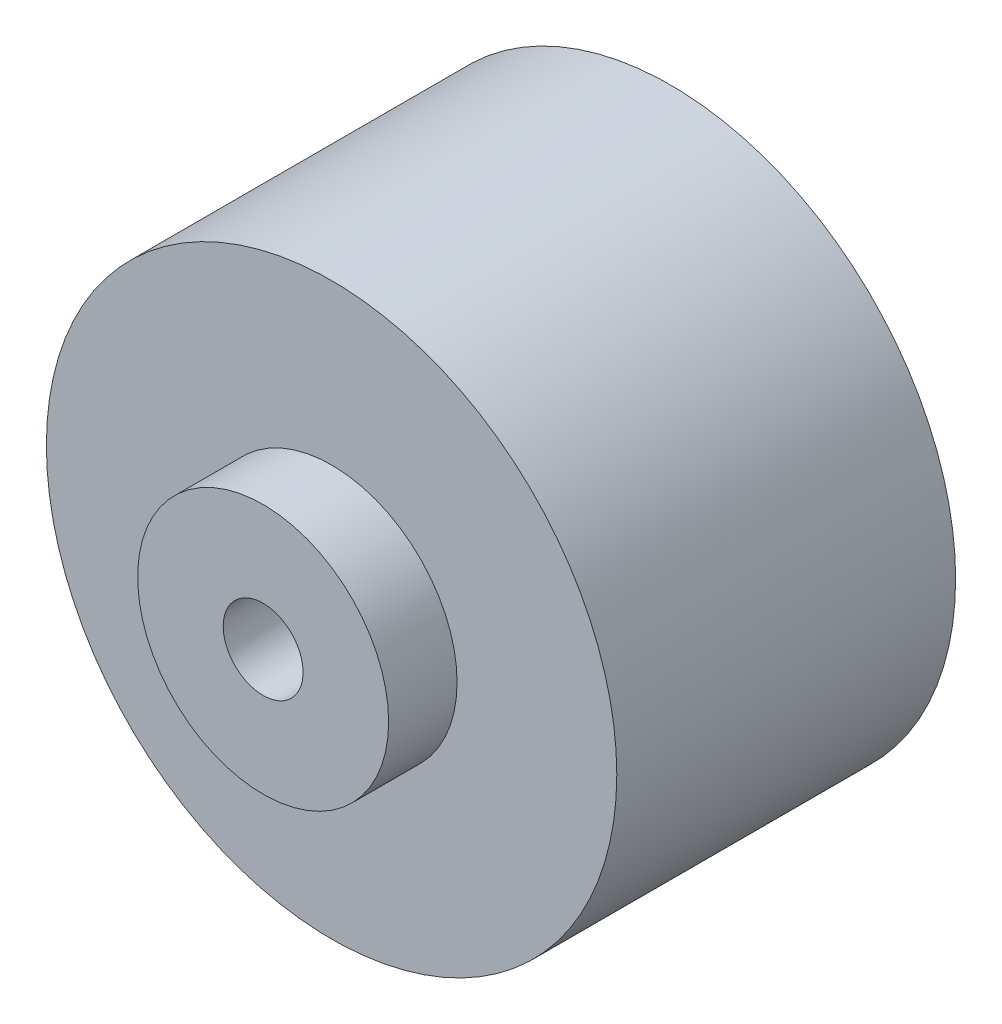
ISO-10303-21;
HEADER;
FILE_DESCRIPTION(('STEP AP214'),'2;1');
FILE_NAME('part.step','',(''),(''),'','','');
FILE_SCHEMA(('AUTOMOTIVE_DESIGN { 1 0 10303 214 1 1 1 1 }'));
ENDSEC;
DATA;
#1=APPLICATION_CONTEXT('core data for automotive mechanical design processes');
#2=APPLICATION_PROTOCOL_DEFINITION('international standard','automotive_design',2000,#1);
#3=PRODUCT_CONTEXT('',#1,'mechanical');
#4=PRODUCT('Part','Part','',(#3));
#5=PRODUCT_RELATED_PRODUCT_CATEGORY('part','',(#4));
#6=PRODUCT_DEFINITION_FORMATION('','',#4);
#7=PRODUCT_DEFINITION_CONTEXT('part definition',#1,'design');
#8=PRODUCT_DEFINITION('design','',#6,#7);
#9=PRODUCT_DEFINITION_SHAPE('','',#8);
#10=(LENGTH_UNIT() NAMED_UNIT(*) SI_UNIT(.MILLI.,.METRE.));
#11=(NAMED_UNIT(*) PLANE_ANGLE_UNIT() SI_UNIT($,.RADIAN.));
#12=(NAMED_UNIT(*) SI_UNIT($,.STERADIAN.) SOLID_ANGLE_UNIT());
#13=UNCERTAINTY_MEASURE_WITH_UNIT(LENGTH_MEASURE(1.E-05),#10,'distance_accuracy_value','');
#14=(GEOMETRIC_REPRESENTATION_CONTEXT(3) GLOBAL_UNCERTAINTY_ASSIGNED_CONTEXT((#13)) GLOBAL_UNIT_ASSIGNED_CONTEXT((#10,
#11,#12)) REPRESENTATION_CONTEXT('',''));
#15=CARTESIAN_POINT('',(0.,0.,0.));
#16=DIRECTION('',(0.,0.,1.));
#17=DIRECTION('',(1.,0.,0.));
#18=AXIS2_PLACEMENT_3D('',#15,#16,#17);
#19=CARTESIAN_POINT('',(0.,0.,29.7));
#20=DIRECTION('',(0.,0.,-1.));
#21=DIRECTION('',(-1.,0.,0.));
#22=AXIS2_PLACEMENT_3D('',#19,#20,#21);
#23=CYLINDRICAL_SURFACE('',#22,25.);
#24=CARTESIAN_POINT('',(0.,0.,29.7));
#25=DIRECTION('',(0.,0.,1.));
#26=DIRECTION('',(1.,0.,0.));
#27=AXIS2_PLACEMENT_3D('',#24,#25,#26);
#28=CIRCLE('',#27,25.);
#29=CARTESIAN_POINT('',(25.,0.,29.7));
#30=VERTEX_POINT('',#29);
#31=EDGE_CURVE('E50',#30,#30,#28,.T.);
#32=ORIENTED_EDGE('',*,*,#31,.F.);
#33=EDGE_LOOP('',(#32));
#34=FACE_BOUND('',#33,.T.);
#35=CARTESIAN_POINT('',(0.,0.,0.));
#36=DIRECTION('',(0.,0.,1.));
#37=DIRECTION('',(1.,0.,0.));
#38=AXIS2_PLACEMENT_3D('',#35,#36,#37);
#39=CIRCLE('',#38,25.);
#40=CARTESIAN_POINT('',(25.,0.,0.));
#41=VERTEX_POINT('',#40);
#42=EDGE_CURVE('E41',#41,#41,#39,.T.);
#43=ORIENTED_EDGE('',*,*,#42,.T.);
#44=EDGE_LOOP('',(#43));
#45=FACE_BOUND('',#44,.T.);
#46=ADVANCED_FACE('F38',(#34,#45),#23,.T.);
#47=CARTESIAN_POINT('',(0.,0.,29.7));
#48=DIRECTION('',(0.,0.,1.));
#49=DIRECTION('',(1.,0.,0.));
#50=AXIS2_PLACEMENT_3D('',#47,#48,#49);
#51=PLANE('',#50);
#52=CARTESIAN_POINT('',(0.,0.,29.7));
#53=DIRECTION('',(0.,0.,1.));
#54=DIRECTION('',(1.,0.,0.));
#55=AXIS2_PLACEMENT_3D('',#52,#53,#54);
#56=CIRCLE('',#55,11.);
#57=CARTESIAN_POINT('',(11.,0.,29.7));
#58=VERTEX_POINT('',#57);
#59=EDGE_CURVE('E45',#58,#58,#56,.T.);
#60=ORIENTED_EDGE('',*,*,#59,.F.);
#61=EDGE_LOOP('',(#60));
#62=FACE_BOUND('',#61,.T.);
#63=ORIENTED_EDGE('',*,*,#31,.T.);
#64=EDGE_LOOP('',(#63));
#65=FACE_BOUND('',#64,.T.);
#66=ADVANCED_FACE('F68',(#62,#65),#51,.T.);
#67=CARTESIAN_POINT('',(0.,0.,0.));
#68=DIRECTION('',(0.,0.,1.));
#69=DIRECTION('',(1.,0.,0.));
#70=AXIS2_PLACEMENT_3D('',#67,#68,#69);
#71=PLANE('',#70);
#72=CARTESIAN_POINT('',(0.,0.,0.));
#73=DIRECTION('',(0.,0.,-1.));
#74=DIRECTION('',(-1.,0.,0.));
#75=AXIS2_PLACEMENT_3D('',#72,#73,#74);
#76=CIRCLE('',#75,12.25);
#77=CARTESIAN_POINT('',(-12.25,0.,0.));
#78=VERTEX_POINT('',#77);
#79=EDGE_CURVE('E10',#78,#78,#76,.T.);
#80=ORIENTED_EDGE('',*,*,#79,.F.);
#81=EDGE_LOOP('',(#80));
#82=FACE_BOUND('',#81,.T.);
#83=ORIENTED_EDGE('',*,*,#42,.F.);
#84=EDGE_LOOP('',(#83));
#85=FACE_BOUND('',#84,.T.);
#86=ADVANCED_FACE('F65',(#82,#85),#71,.F.);
#87=CARTESIAN_POINT('',(0.,0.,35.7));
#88=DIRECTION('',(0.,0.,-1.));
#89=DIRECTION('',(-1.,0.,0.));
#90=AXIS2_PLACEMENT_3D('',#87,#88,#89);
#91=CYLINDRICAL_SURFACE('',#90,11.);
#92=CARTESIAN_POINT('',(0.,0.,35.7));
#93=DIRECTION('',(0.,0.,1.));
#94=DIRECTION('',(1.,0.,0.));
#95=AXIS2_PLACEMENT_3D('',#92,#93,#94);
#96=CIRCLE('',#95,11.);
#97=CARTESIAN_POINT('',(11.,0.,35.7));
#98=VERTEX_POINT('',#97);
#99=EDGE_CURVE('E56',#98,#98,#96,.T.);
#100=ORIENTED_EDGE('',*,*,#99,.F.);
#101=EDGE_LOOP('',(#100));
#102=FACE_BOUND('',#101,.T.);
#103=ORIENTED_EDGE('',*,*,#59,.T.);
#104=EDGE_LOOP('',(#103));
#105=FACE_BOUND('',#104,.T.);
#106=ADVANCED_FACE('F67',(#102,#105),#91,.T.);
#107=CARTESIAN_POINT('',(0.,0.,35.7));
#108=DIRECTION('',(0.,0.,1.));
#109=DIRECTION('',(1.,0.,0.));
#110=AXIS2_PLACEMENT_3D('',#107,#108,#109);
#111=PLANE('',#110);
#112=CARTESIAN_POINT('',(0.,0.,35.7));
#113=DIRECTION('',(0.,0.,-1.));
#114=DIRECTION('',(-1.,0.,0.));
#115=AXIS2_PLACEMENT_3D('',#112,#113,#114);
#116=CIRCLE('',#115,3.5);
#117=CARTESIAN_POINT('',(-3.5,0.,35.7));
#118=VERTEX_POINT('',#117);
#119=EDGE_CURVE('E143',#118,#118,#116,.T.);
#120=ORIENTED_EDGE('',*,*,#119,.T.);
#121=EDGE_LOOP('',(#120));
#122=FACE_BOUND('',#121,.T.);
#123=ORIENTED_EDGE('',*,*,#99,.T.);
#124=EDGE_LOOP('',(#123));
#125=FACE_BOUND('',#124,.T.);
#126=ADVANCED_FACE('F74',(#122,#125),#111,.T.);
#127=CARTESIAN_POINT('',(0.,0.,-9.));
#128=DIRECTION('',(0.,0.,1.));
#129=DIRECTION('',(1.,0.,0.));
#130=AXIS2_PLACEMENT_3D('',#127,#128,#129);
#131=CYLINDRICAL_SURFACE('',#130,12.25);
#132=CARTESIAN_POINT('',(0.,0.,-9.));
#133=DIRECTION('',(0.,0.,-1.));
#134=DIRECTION('',(-1.,0.,0.));
#135=AXIS2_PLACEMENT_3D('',#132,#133,#134);
#136=CIRCLE('',#135,12.25);
#137=CARTESIAN_POINT('',(-12.25,0.,-9.));
#138=VERTEX_POINT('',#137);
#139=EDGE_CURVE('E54',#138,#138,#136,.T.);
#140=ORIENTED_EDGE('',*,*,#139,.F.);
#141=EDGE_LOOP('',(#140));
#142=FACE_BOUND('',#141,.T.);
#143=ORIENTED_EDGE('',*,*,#79,.T.);
#144=EDGE_LOOP('',(#143));
#145=FACE_BOUND('',#144,.T.);
#146=ADVANCED_FACE('F104',(#142,#145),#131,.T.);
#147=CARTESIAN_POINT('',(0.,0.,-9.));
#148=DIRECTION('',(0.,0.,-1.));
#149=DIRECTION('',(-1.,0.,0.));
#150=AXIS2_PLACEMENT_3D('',#147,#148,#149);
#151=PLANE('',#150);
#152=CARTESIAN_POINT('',(0.,0.,-9.));
#153=DIRECTION('',(0.,0.,-1.));
#154=DIRECTION('',(-1.,0.,0.));
#155=AXIS2_PLACEMENT_3D('',#152,#153,#154);
#156=CIRCLE('',#155,3.5);
#157=CARTESIAN_POINT('',(-3.5,0.,-8.99999999999999));
#158=VERTEX_POINT('',#157);
#159=EDGE_CURVE('E146',#158,#158,#156,.T.);
#160=ORIENTED_EDGE('',*,*,#159,.F.);
#161=EDGE_LOOP('',(#160));
#162=FACE_BOUND('',#161,.T.);
#163=ORIENTED_EDGE('',*,*,#139,.T.);
#164=EDGE_LOOP('',(#163));
#165=FACE_BOUND('',#164,.T.);
#166=ADVANCED_FACE('F109',(#162,#165),#151,.T.);
#167=CARTESIAN_POINT('',(0.,0.,35.7));
#168=DIRECTION('',(0.,0.,-1.));
#169=DIRECTION('',(-1.,0.,0.));
#170=AXIS2_PLACEMENT_3D('',#167,#168,#169);
#171=CYLINDRICAL_SURFACE('',#170,3.5);
#172=CARTESIAN_POINT('',(-3.5,0.,35.7));
#173=CARTESIAN_POINT('',(-3.5,0.,35.234375));
#174=CARTESIAN_POINT('',(-3.5,0.,34.76875));
#175=CARTESIAN_POINT('',(-3.5,0.,33.8375));
#176=CARTESIAN_POINT('',(-3.5,0.,33.371875));
#177=CARTESIAN_POINT('',(-3.5,0.,32.440625));
#178=CARTESIAN_POINT('',(-3.5,0.,31.975));
#179=CARTESIAN_POINT('',(-3.5,0.,31.04375));
#180=CARTESIAN_POINT('',(-3.5,0.,30.578125));
#181=CARTESIAN_POINT('',(-3.5,0.,29.646875));
#182=CARTESIAN_POINT('',(-3.5,0.,29.18125));
#183=CARTESIAN_POINT('',(-3.5,0.,28.25));
#184=CARTESIAN_POINT('',(-3.5,0.,27.784375));
#185=CARTESIAN_POINT('',(-3.5,0.,26.853125));
#186=CARTESIAN_POINT('',(-3.5,0.,26.3875));
#187=CARTESIAN_POINT('',(-3.5,0.,25.45625));
#188=CARTESIAN_POINT('',(-3.5,0.,24.990625));
#189=CARTESIAN_POINT('',(-3.5,0.,24.059375));
#190=CARTESIAN_POINT('',(-3.5,0.,23.59375));
#191=CARTESIAN_POINT('',(-3.5,0.,22.6625));
#192=CARTESIAN_POINT('',(-3.5,0.,22.196875));
#193=CARTESIAN_POINT('',(-3.5,0.,21.265625));
#194=CARTESIAN_POINT('',(-3.5,0.,20.8));
#195=CARTESIAN_POINT('',(-3.5,0.,19.86875));
#196=CARTESIAN_POINT('',(-3.5,0.,19.403125));
#197=CARTESIAN_POINT('',(-3.5,0.,18.471875));
#198=CARTESIAN_POINT('',(-3.5,0.,18.00625));
#199=CARTESIAN_POINT('',(-3.5,0.,17.075));
#200=CARTESIAN_POINT('',(-3.5,0.,16.609375));
#201=CARTESIAN_POINT('',(-3.5,0.,15.678125));
#202=CARTESIAN_POINT('',(-3.5,0.,15.2125));
#203=CARTESIAN_POINT('',(-3.5,0.,14.28125));
#204=CARTESIAN_POINT('',(-3.5,0.,13.815625));
#205=CARTESIAN_POINT('',(-3.5,0.,12.884375));
#206=CARTESIAN_POINT('',(-3.5,0.,12.41875));
#207=CARTESIAN_POINT('',(-3.5,0.,11.4875));
#208=CARTESIAN_POINT('',(-3.5,0.,11.021875));
#209=CARTESIAN_POINT('',(-3.5,0.,10.090625));
#210=CARTESIAN_POINT('',(-3.5,0.,9.625));
#211=CARTESIAN_POINT('',(-3.5,0.,8.69375));
#212=CARTESIAN_POINT('',(-3.5,0.,8.228125));
#213=CARTESIAN_POINT('',(-3.5,0.,7.296875));
#214=CARTESIAN_POINT('',(-3.5,0.,6.83125));
#215=CARTESIAN_POINT('',(-3.5,0.,5.9));
#216=CARTESIAN_POINT('',(-3.5,0.,5.434375));
#217=CARTESIAN_POINT('',(-3.5,0.,4.503125));
#218=CARTESIAN_POINT('',(-3.5,0.,4.03750000000001));
#219=CARTESIAN_POINT('',(-3.5,0.,3.10625000000001));
#220=CARTESIAN_POINT('',(-3.5,0.,2.64062500000001));
#221=CARTESIAN_POINT('',(-3.5,0.,1.70937500000001));
#222=CARTESIAN_POINT('',(-3.5,0.,1.24375000000001));
#223=CARTESIAN_POINT('',(-3.5,0.,0.31250000000001));
#224=CARTESIAN_POINT('',(-3.5,0.,-0.153124999999992));
#225=CARTESIAN_POINT('',(-3.5,0.,-1.08437499999999));
#226=CARTESIAN_POINT('',(-3.5,0.,-1.54999999999999));
#227=CARTESIAN_POINT('',(-3.5,0.,-2.48124999999999));
#228=CARTESIAN_POINT('',(-3.5,0.,-2.94687499999999));
#229=CARTESIAN_POINT('',(-3.5,0.,-3.87812499999999));
#230=CARTESIAN_POINT('',(-3.5,0.,-4.34374999999999));
#231=CARTESIAN_POINT('',(-3.5,0.,-5.27499999999999));
#232=CARTESIAN_POINT('',(-3.5,0.,-5.740625));
#233=CARTESIAN_POINT('',(-3.5,0.,-6.671875));
#234=CARTESIAN_POINT('',(-3.5,0.,-7.1375));
#235=CARTESIAN_POINT('',(-3.5,0.,-8.06874999999999));
#236=CARTESIAN_POINT('',(-3.5,0.,-8.534375));
#237=CARTESIAN_POINT('',(-3.5,0.,-8.99999999999999));
#238=B_SPLINE_CURVE_WITH_KNOTS('',3,(#172,#173,#174,#175,#176,#177,#178,#179,#180,#181,#182,
#183,#184,#185,#186,#187,#188,#189,#190,#191,#192,#193,#194,#195,#196,#197,#198,#199,#200,#201,
#202,#203,#204,#205,#206,#207,#208,#209,#210,#211,#212,#213,#214,#215,#216,#217,#218,#219,#220,
#221,#222,#223,#224,#225,#226,#227,#228,#229,#230,#231,#232,#233,#234,#235,#236,#237),
.UNSPECIFIED.,.F.,.F.,(4,2,2,2,2,2,2,2,2,2,2,2,2,2,2,2,2,2,2,2,2,2,2,2,2,2,2,2,2,2,2,2,4),(0.,
1.39687500000001,2.79375,4.190625,5.5875,6.984375,8.38125,9.77812500000001,11.175,12.571875,
13.96875,15.365625,16.7625,18.159375,19.55625,20.953125,22.35,23.746875,25.14375,26.540625,
27.9375,29.334375,30.73125,32.128125,33.525,34.921875,36.31875,37.715625,39.1125,40.509375,
41.90625,43.303125,44.7),.UNSPECIFIED.);
#239=EDGE_CURVE('BSEAM126',#118,#158,#238,.T.);
#240=ORIENTED_EDGE('',*,*,#119,.F.);
#241=ORIENTED_EDGE('',*,*,#159,.T.);
#242=ORIENTED_EDGE('',*,*,#239,.T.);
#243=ORIENTED_EDGE('',*,*,#239,.F.);
#244=EDGE_LOOP('',(#240,#242,#241,#243));
#245=FACE_BOUND('',#244,.T.);
#246=ADVANCED_FACE('F126',(#245),#171,.F.);
#247=CLOSED_SHELL('',(#46,#66,#86,#106,#126,#146,#166,#246));
#248=MANIFOLD_SOLID_BREP('B2',#247);
#249=ADVANCED_BREP_SHAPE_REPRESENTATION('',(#18,#248),#14);
#250=SHAPE_DEFINITION_REPRESENTATION(#9,#249);
ENDSEC;
END-ISO-10303-21;
